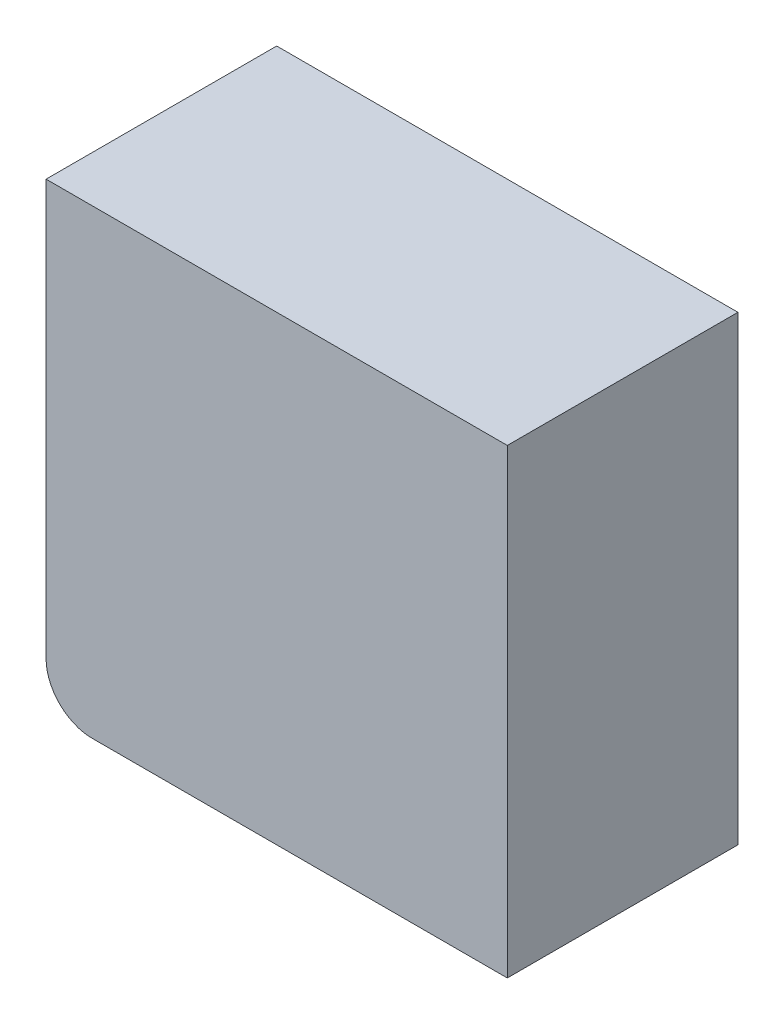
ISO-10303-21;
HEADER;
FILE_DESCRIPTION(('STEP AP214'),'2;1');
FILE_NAME('part.step','',(''),(''),'','','');
FILE_SCHEMA(('AUTOMOTIVE_DESIGN { 1 0 10303 214 1 1 1 1 }'));
ENDSEC;
DATA;
#1=APPLICATION_CONTEXT('core data for automotive mechanical design processes');
#2=APPLICATION_PROTOCOL_DEFINITION('international standard','automotive_design',2000,#1);
#3=PRODUCT_CONTEXT('',#1,'mechanical');
#4=PRODUCT('Part','Part','',(#3));
#5=PRODUCT_RELATED_PRODUCT_CATEGORY('part','',(#4));
#6=PRODUCT_DEFINITION_FORMATION('','',#4);
#7=PRODUCT_DEFINITION_CONTEXT('part definition',#1,'design');
#8=PRODUCT_DEFINITION('design','',#6,#7);
#9=PRODUCT_DEFINITION_SHAPE('','',#8);
#10=(LENGTH_UNIT() NAMED_UNIT(*) SI_UNIT(.MILLI.,.METRE.));
#11=(NAMED_UNIT(*) PLANE_ANGLE_UNIT() SI_UNIT($,.RADIAN.));
#12=(NAMED_UNIT(*) SI_UNIT($,.STERADIAN.) SOLID_ANGLE_UNIT());
#13=UNCERTAINTY_MEASURE_WITH_UNIT(LENGTH_MEASURE(1.E-05),#10,'distance_accuracy_value','');
#14=(GEOMETRIC_REPRESENTATION_CONTEXT(3) GLOBAL_UNCERTAINTY_ASSIGNED_CONTEXT((#13)) GLOBAL_UNIT_ASSIGNED_CONTEXT((#10,
#11,#12)) REPRESENTATION_CONTEXT('',''));
#15=CARTESIAN_POINT('',(0.,0.,0.));
#16=DIRECTION('',(0.,0.,1.));
#17=DIRECTION('',(1.,0.,0.));
#18=AXIS2_PLACEMENT_3D('',#15,#16,#17);
#19=CARTESIAN_POINT('',(0.,0.,10.));
#20=DIRECTION('',(1.,0.,0.));
#21=DIRECTION('',(0.,0.,-1.));
#22=AXIS2_PLACEMENT_3D('',#19,#20,#21);
#23=PLANE('',#22);
#24=DIRECTION('',(0.,-1.,0.));
#25=VECTOR('',#24,1.);
#26=CARTESIAN_POINT('',(0.,0.,0.));
#27=LINE('',#26,#25);
#28=CARTESIAN_POINT('',(0.,20.,0.));
#29=VERTEX_POINT('',#28);
#30=CARTESIAN_POINT('',(0.,4.,0.));
#31=VERTEX_POINT('',#30);
#32=EDGE_CURVE('E128',#29,#31,#27,.T.);
#33=ORIENTED_EDGE('',*,*,#32,.T.);
#34=CARTESIAN_POINT('',(0.,0.,20.));
#35=CARTESIAN_POINT('',(0.,0.666666666666667,16.6666666666667));
#36=CARTESIAN_POINT('',(0.,1.33333333333333,13.3333333333333));
#37=CARTESIAN_POINT('',(0.,2.,10.));
#38=CARTESIAN_POINT('',(0.,2.66666666666667,6.66666666666667));
#39=CARTESIAN_POINT('',(0.,3.33333333333333,3.33333333333334));
#40=CARTESIAN_POINT('',(0.,4.,0.));
#41=CARTESIAN_POINT('',(0.,5.33333333333333,-6.66666666666667));
#42=CARTESIAN_POINT('',(0.,6.66666666666667,-13.3333333333333));
#43=CARTESIAN_POINT('',(0.,8.,-20.));
#44=(BOUNDED_CURVE() B_SPLINE_CURVE(3,(#34,#35,#36,#37,#38,#39,#40,#41,#42,#43),.UNSPECIFIED.,
.F.,.F.) B_SPLINE_CURVE_WITH_KNOTS((4,3,3,4),(-0.01,0.,0.01,0.03),
.UNSPECIFIED.) CURVE() GEOMETRIC_REPRESENTATION_ITEM() RATIONAL_B_SPLINE_CURVE((1.,1.,1.,1.,1.,
1.,1.,1.,1.,1.)) REPRESENTATION_ITEM(''));
#45=CARTESIAN_POINT('',(0.,2.,10.));
#46=VERTEX_POINT('',#45);
#47=EDGE_CURVE('E64',#31,#46,#44,.F.);
#48=ORIENTED_EDGE('',*,*,#47,.T.);
#49=DIRECTION('',(0.,-1.,0.));
#50=VECTOR('',#49,1.);
#51=CARTESIAN_POINT('',(0.,0.,10.));
#52=LINE('',#51,#50);
#53=CARTESIAN_POINT('',(0.,20.,10.));
#54=VERTEX_POINT('',#53);
#55=EDGE_CURVE('E109',#54,#46,#52,.T.);
#56=ORIENTED_EDGE('',*,*,#55,.F.);
#57=DIRECTION('',(0.,0.,-1.));
#58=VECTOR('',#57,1.);
#59=CARTESIAN_POINT('',(0.,20.,10.));
#60=LINE('',#59,#58);
#61=EDGE_CURVE('E127',#54,#29,#60,.T.);
#62=ORIENTED_EDGE('',*,*,#61,.T.);
#63=EDGE_LOOP('',(#33,#48,#56,#62));
#64=FACE_BOUND('',#63,.T.);
#65=ADVANCED_FACE('F44',(#64),#23,.F.);
#66=CARTESIAN_POINT('',(0.,0.,10.));
#67=DIRECTION('',(0.,1.,0.));
#68=DIRECTION('',(0.,0.,1.));
#69=AXIS2_PLACEMENT_3D('',#66,#67,#68);
#70=PLANE('',#69);
#71=DIRECTION('',(1.,0.,0.));
#72=VECTOR('',#71,1.);
#73=CARTESIAN_POINT('',(0.,0.,10.));
#74=LINE('',#73,#72);
#75=CARTESIAN_POINT('',(2.,0.,10.));
#76=VERTEX_POINT('',#75);
#77=CARTESIAN_POINT('',(20.,0.,10.));
#78=VERTEX_POINT('',#77);
#79=EDGE_CURVE('E99',#76,#78,#74,.T.);
#80=ORIENTED_EDGE('',*,*,#79,.F.);
#81=CARTESIAN_POINT('',(0.,0.,20.));
#82=CARTESIAN_POINT('',(0.666666666666667,0.,16.6666666666667));
#83=CARTESIAN_POINT('',(1.33333333333333,0.,13.3333333333333));
#84=CARTESIAN_POINT('',(2.,0.,10.));
#85=CARTESIAN_POINT('',(2.66666666666667,0.,6.66666666666667));
#86=CARTESIAN_POINT('',(3.33333333333333,0.,3.33333333333334));
#87=CARTESIAN_POINT('',(4.,0.,0.));
#88=CARTESIAN_POINT('',(5.33333333333333,0.,-6.66666666666667));
#89=CARTESIAN_POINT('',(6.66666666666667,0.,-13.3333333333333));
#90=CARTESIAN_POINT('',(8.,0.,-20.));
#91=(BOUNDED_CURVE() B_SPLINE_CURVE(3,(#81,#82,#83,#84,#85,#86,#87,#88,#89,#90),.UNSPECIFIED.,
.F.,.F.) B_SPLINE_CURVE_WITH_KNOTS((4,3,3,4),(-0.01,0.,0.01,0.03),
.UNSPECIFIED.) CURVE() GEOMETRIC_REPRESENTATION_ITEM() RATIONAL_B_SPLINE_CURVE((1.,1.,1.,1.,1.,
1.,1.,1.,1.,1.)) REPRESENTATION_ITEM(''));
#92=CARTESIAN_POINT('',(4.,0.,0.));
#93=VERTEX_POINT('',#92);
#94=EDGE_CURVE('E117',#76,#93,#91,.T.);
#95=ORIENTED_EDGE('',*,*,#94,.T.);
#96=DIRECTION('',(1.,0.,0.));
#97=VECTOR('',#96,1.);
#98=CARTESIAN_POINT('',(0.,0.,0.));
#99=LINE('',#98,#97);
#100=CARTESIAN_POINT('',(20.,0.,0.));
#101=VERTEX_POINT('',#100);
#102=EDGE_CURVE('E113',#93,#101,#99,.T.);
#103=ORIENTED_EDGE('',*,*,#102,.T.);
#104=DIRECTION('',(0.,0.,-1.));
#105=VECTOR('',#104,1.);
#106=CARTESIAN_POINT('',(20.,0.,10.));
#107=LINE('',#106,#105);
#108=EDGE_CURVE('E114',#78,#101,#107,.T.);
#109=ORIENTED_EDGE('',*,*,#108,.F.);
#110=EDGE_LOOP('',(#80,#95,#103,#109));
#111=FACE_BOUND('',#110,.T.);
#112=ADVANCED_FACE('F111',(#111),#70,.F.);
#113=CARTESIAN_POINT('',(20.,0.,10.));
#114=DIRECTION('',(-1.,0.,0.));
#115=DIRECTION('',(0.,0.,1.));
#116=AXIS2_PLACEMENT_3D('',#113,#114,#115);
#117=PLANE('',#116);
#118=DIRECTION('',(0.,1.,0.));
#119=VECTOR('',#118,1.);
#120=CARTESIAN_POINT('',(20.,0.,0.));
#121=LINE('',#120,#119);
#122=CARTESIAN_POINT('',(20.,20.,0.));
#123=VERTEX_POINT('',#122);
#124=EDGE_CURVE('E132',#101,#123,#121,.T.);
#125=ORIENTED_EDGE('',*,*,#124,.T.);
#126=DIRECTION('',(0.,0.,-1.));
#127=VECTOR('',#126,1.);
#128=CARTESIAN_POINT('',(20.,20.,10.));
#129=LINE('',#128,#127);
#130=CARTESIAN_POINT('',(20.,20.,10.));
#131=VERTEX_POINT('',#130);
#132=EDGE_CURVE('E120',#131,#123,#129,.T.);
#133=ORIENTED_EDGE('',*,*,#132,.F.);
#134=DIRECTION('',(0.,1.,0.));
#135=VECTOR('',#134,1.);
#136=CARTESIAN_POINT('',(20.,0.,10.));
#137=LINE('',#136,#135);
#138=EDGE_CURVE('E102',#78,#131,#137,.T.);
#139=ORIENTED_EDGE('',*,*,#138,.F.);
#140=ORIENTED_EDGE('',*,*,#108,.T.);
#141=EDGE_LOOP('',(#125,#133,#139,#140));
#142=FACE_BOUND('',#141,.T.);
#143=ADVANCED_FACE('F121',(#142),#117,.F.);
#144=CARTESIAN_POINT('',(0.,20.,10.));
#145=DIRECTION('',(0.,-1.,0.));
#146=DIRECTION('',(0.,0.,-1.));
#147=AXIS2_PLACEMENT_3D('',#144,#145,#146);
#148=PLANE('',#147);
#149=DIRECTION('',(-1.,0.,0.));
#150=VECTOR('',#149,1.);
#151=CARTESIAN_POINT('',(0.,20.,0.));
#152=LINE('',#151,#150);
#153=EDGE_CURVE('E131',#123,#29,#152,.T.);
#154=ORIENTED_EDGE('',*,*,#153,.T.);
#155=ORIENTED_EDGE('',*,*,#61,.F.);
#156=DIRECTION('',(-1.,0.,0.));
#157=VECTOR('',#156,1.);
#158=CARTESIAN_POINT('',(0.,20.,10.));
#159=LINE('',#158,#157);
#160=EDGE_CURVE('E123',#131,#54,#159,.T.);
#161=ORIENTED_EDGE('',*,*,#160,.F.);
#162=ORIENTED_EDGE('',*,*,#132,.T.);
#163=EDGE_LOOP('',(#154,#155,#161,#162));
#164=FACE_BOUND('',#163,.T.);
#165=ADVANCED_FACE('F158',(#164),#148,.F.);
#166=CARTESIAN_POINT('',(0.,0.,10.));
#167=DIRECTION('',(0.,0.,-1.));
#168=DIRECTION('',(-1.,0.,0.));
#169=AXIS2_PLACEMENT_3D('',#166,#167,#168);
#170=PLANE('',#169);
#171=ORIENTED_EDGE('',*,*,#55,.T.);
#172=CARTESIAN_POINT('',(0.,2.,10.));
#173=CARTESIAN_POINT('',(3.74251631470257E-07,1.94373048936564,10.));
#174=CARTESIAN_POINT('',(0.00237618317994918,1.8874879362044,10.));
#175=CARTESIAN_POINT('',(0.0118542518720819,1.77540529314379,10.));
#176=CARTESIAN_POINT('',(0.0189562849102177,1.71956518406831,10.));
#177=CARTESIAN_POINT('',(0.0472842555983417,1.55334615406956,10.));
#178=CARTESIAN_POINT('',(0.0755322519745188,1.44408063870614,10.));
#179=CARTESIAN_POINT('',(0.149970457147298,1.23184601702361,10.));
#180=CARTESIAN_POINT('',(0.196169281212486,1.12887996155547,10.));
#181=CARTESIAN_POINT('',(0.305192910689422,0.93216839106375,10.));
#182=CARTESIAN_POINT('',(0.368014787224392,0.838421255712003,10.));
#183=CARTESIAN_POINT('',(0.508502137265167,0.662808351287564,10.));
#184=CARTESIAN_POINT('',(0.586167465909335,0.580942466275956,10.));
#185=CARTESIAN_POINT('',(0.754158332606448,0.431394041736219,10.));
#186=CARTESIAN_POINT('',(0.844486344365823,0.363714279986295,10.));
#187=CARTESIAN_POINT('',(1.03523164715461,0.244471425698472,10.));
#188=CARTESIAN_POINT('',(1.13565090834655,0.19291148841998,10.));
#189=CARTESIAN_POINT('',(1.34370060514106,0.107409039126678,10.));
#190=CARTESIAN_POINT('',(1.45132677534186,0.0734562086210957,10.));
#191=CARTESIAN_POINT('',(1.6330096341278,0.032569722175987,10.));
#192=CARTESIAN_POINT('',(1.70592340735455,0.0203634568517979,10.));
#193=CARTESIAN_POINT('',(1.85254793097786,0.0040796724044915,10.));
#194=CARTESIAN_POINT('',(1.92625740193243,-9.37065746646299E-06,10.));
#195=CARTESIAN_POINT('',(2.,0.,10.));
#196=B_SPLINE_CURVE_WITH_KNOTS('',3,(#172,#173,#174,#175,#176,#177,#178,#179,#180,#181,#182,
#183,#184,#185,#186,#187,#188,#189,#190,#191,#192,#193,#194,#195),.UNSPECIFIED.,.F.,.F.,(4,2,2,
2,2,2,2,2,2,2,2,4),(0.,0.168704845107152,0.337401597715371,0.674238602360138,1.01123746766622,
1.34817699539413,1.68511323499748,2.02211538842366,2.35918346468006,2.69605378126895,
2.91741828708136,3.13846829853264),.UNSPECIFIED.);
#197=EDGE_CURVE('E11',#46,#76,#196,.T.);
#198=ORIENTED_EDGE('',*,*,#197,.T.);
#199=ORIENTED_EDGE('',*,*,#79,.T.);
#200=ORIENTED_EDGE('',*,*,#138,.T.);
#201=ORIENTED_EDGE('',*,*,#160,.T.);
#202=EDGE_LOOP('',(#171,#198,#199,#200,#201));
#203=FACE_BOUND('',#202,.T.);
#204=ADVANCED_FACE('F105',(#203),#170,.F.);
#205=CARTESIAN_POINT('',(0.,0.,0.));
#206=DIRECTION('',(0.,0.,-1.));
#207=DIRECTION('',(-1.,0.,0.));
#208=AXIS2_PLACEMENT_3D('',#205,#206,#207);
#209=PLANE('',#208);
#210=ORIENTED_EDGE('',*,*,#102,.F.);
#211=CARTESIAN_POINT('',(4.,0.,0.));
#212=CARTESIAN_POINT('',(3.88749351533111,-1.07801609130308E-05,0.));
#213=CARTESIAN_POINT('',(3.77499214031853,0.00474660216606653,0.));
#214=CARTESIAN_POINT('',(3.5507943191582,0.0237142676614965,0.));
#215=CARTESIAN_POINT('',(3.43909783465817,0.037924097378615,0.));
#216=CARTESIAN_POINT('',(3.21737735873488,0.0756989713517406,0.));
#217=CARTESIAN_POINT('',(3.10735216732033,0.0992569385292704,0.));
#218=CARTESIAN_POINT('',(2.88970424637566,0.155536996449337,0.));
#219=CARTESIAN_POINT('',(2.7820814875359,0.188258975325049,0.));
#220=CARTESIAN_POINT('',(2.46385527614936,0.299906592831896,0.));
#221=CARTESIAN_POINT('',(2.25780366012244,0.392329366769015,0.));
#222=CARTESIAN_POINT('',(1.86429305281706,0.610395015415662,0.));
#223=CARTESIAN_POINT('',(1.67683079420265,0.736032037980989,0.));
#224=CARTESIAN_POINT('',(1.32562841968213,1.01700181102217,0.));
#225=CARTESIAN_POINT('',(1.16188807229429,1.17233427169148,0.));
#226=CARTESIAN_POINT('',(0.862784943115835,1.50831732546923,0.));
#227=CARTESIAN_POINT('',(0.727427719009325,1.6889728655432,0.));
#228=CARTESIAN_POINT('',(0.488943692524713,2.07046311746308,0.));
#229=CARTESIAN_POINT('',(0.385823200094784,2.27130176975404,0.));
#230=CARTESIAN_POINT('',(0.214817855129516,2.68740125719365,0.));
#231=CARTESIAN_POINT('',(0.146912365149718,2.90265356163611,0.));
#232=CARTESIAN_POINT('',(0.0651394785830237,3.26601926105856,0.));
#233=CARTESIAN_POINT('',(0.0407269308069539,3.41184681111314,0.));
#234=CARTESIAN_POINT('',(0.00815932772992342,3.70509586554657,0.));
#235=CARTESIAN_POINT('',(-1.877544878748E-05,3.85251481104147,0.));
#236=CARTESIAN_POINT('',(0.,4.,0.));
#237=B_SPLINE_CURVE_WITH_KNOTS('',3,(#211,#212,#213,#214,#215,#216,#217,#218,#219,#220,#221,
#222,#223,#224,#225,#226,#227,#228,#229,#230,#231,#232,#233,#234,#235,#236),.UNSPECIFIED.,.F.,
.F.,(4,2,2,2,2,2,2,2,2,2,2,2,4),(0.,0.337409690214305,0.674803195430742,1.01194176015836,
1.34907620955113,2.02307394016331,2.69695299561913,3.37082547482583,4.04482978167817,
4.71896593419098,5.39270656736875,5.83543557899357,6.27753560189614),.UNSPECIFIED.);
#238=EDGE_CURVE('E78',#93,#31,#237,.T.);
#239=ORIENTED_EDGE('',*,*,#238,.T.);
#240=ORIENTED_EDGE('',*,*,#32,.F.);
#241=ORIENTED_EDGE('',*,*,#153,.F.);
#242=ORIENTED_EDGE('',*,*,#124,.F.);
#243=EDGE_LOOP('',(#210,#239,#240,#241,#242));
#244=FACE_BOUND('',#243,.T.);
#245=ADVANCED_FACE('F153',(#244),#209,.T.);
#246=CARTESIAN_POINT('',(1.6,0.,12.));
#247=CARTESIAN_POINT('',(1.73333333333333,0.,11.3333333333333));
#248=CARTESIAN_POINT('',(1.86666666666667,0.,10.6666666666667));
#249=CARTESIAN_POINT('',(2.,0.,10.));
#250=CARTESIAN_POINT('',(2.66666666666667,0.,6.66666666666667));
#251=CARTESIAN_POINT('',(3.33333333333333,0.,3.33333333333334));
#252=CARTESIAN_POINT('',(4.,0.,0.));
#253=CARTESIAN_POINT('',(4.13333333333333,0.,-0.666666666666667));
#254=CARTESIAN_POINT('',(4.26666666666667,0.,-1.33333333333334));
#255=CARTESIAN_POINT('',(4.4,0.,-2.));
#256=CARTESIAN_POINT('',(0.,0.,12.));
#257=CARTESIAN_POINT('',(0.,0.,11.3333333333333));
#258=CARTESIAN_POINT('',(0.,0.,10.6666666666667));
#259=CARTESIAN_POINT('',(0.,0.,10.));
#260=CARTESIAN_POINT('',(0.,0.,6.66666666666667));
#261=CARTESIAN_POINT('',(0.,0.,3.33333333333334));
#262=CARTESIAN_POINT('',(0.,0.,0.));
#263=CARTESIAN_POINT('',(0.,0.,-0.666666666666667));
#264=CARTESIAN_POINT('',(0.,0.,-1.33333333333334));
#265=CARTESIAN_POINT('',(0.,0.,-2.));
#266=CARTESIAN_POINT('',(0.,1.6,12.));
#267=CARTESIAN_POINT('',(0.,1.73333333333333,11.3333333333333));
#268=CARTESIAN_POINT('',(0.,1.86666666666667,10.6666666666667));
#269=CARTESIAN_POINT('',(0.,2.,10.));
#270=CARTESIAN_POINT('',(0.,2.66666666666667,6.66666666666667));
#271=CARTESIAN_POINT('',(0.,3.33333333333333,3.33333333333334));
#272=CARTESIAN_POINT('',(0.,4.,0.));
#273=CARTESIAN_POINT('',(0.,4.13333333333333,-0.666666666666667));
#274=CARTESIAN_POINT('',(0.,4.26666666666667,-1.33333333333334));
#275=CARTESIAN_POINT('',(0.,4.4,-2.));
#276=(BOUNDED_SURFACE() B_SPLINE_SURFACE(2,3,((#246,#247,#248,#249,#250,#251,#252,#253,#254,
#255),(#256,#257,#258,#259,#260,#261,#262,#263,#264,#265),(#266,#267,#268,#269,#270,#271,#272,
#273,#274,#275)),.UNSPECIFIED.,.F.,.F.,.F.) B_SPLINE_SURFACE_WITH_KNOTS((3,3),(4,3,3,4),(0.,1.),
(-0.002,0.,0.01,0.012),
.UNSPECIFIED.) GEOMETRIC_REPRESENTATION_ITEM() RATIONAL_B_SPLINE_SURFACE(((1.,1.,1.,1.,1.,1.,1.,
1.,1.,1.),(0.707106781186548,0.707106781186548,0.707106781186548,0.707106781186548,
0.707106781186548,0.707106781186548,0.707106781186548,0.707106781186548,0.707106781186548,
0.707106781186548),(1.,1.,1.,1.,1.,1.,1.,1.,1.,1.))) REPRESENTATION_ITEM('') SURFACE());
#277=ORIENTED_EDGE('',*,*,#197,.F.);
#278=ORIENTED_EDGE('',*,*,#47,.F.);
#279=ORIENTED_EDGE('',*,*,#238,.F.);
#280=ORIENTED_EDGE('',*,*,#94,.F.);
#281=EDGE_LOOP('',(#277,#278,#279,#280));
#282=FACE_BOUND('',#281,.T.);
#283=ADVANCED_FACE('F48',(#282),#276,.T.);
#284=CLOSED_SHELL('',(#65,#112,#143,#165,#204,#245,#283));
#285=MANIFOLD_SOLID_BREP('B2',#284);
#286=ADVANCED_BREP_SHAPE_REPRESENTATION('',(#18,#285),#14);
#287=SHAPE_DEFINITION_REPRESENTATION(#9,#286);
ENDSEC;
END-ISO-10303-21;
